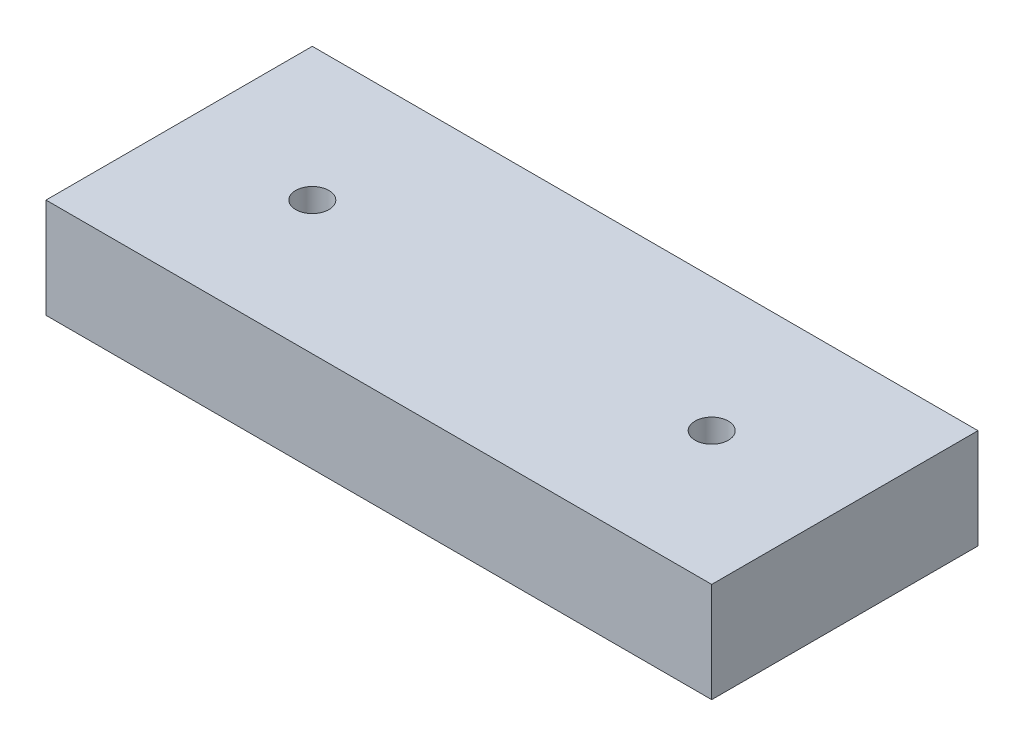
ISO-10303-21;
HEADER;
FILE_DESCRIPTION(('STEP AP214'),'2;1');
FILE_NAME('part.step','',(''),(''),'','','');
FILE_SCHEMA(('AUTOMOTIVE_DESIGN { 1 0 10303 214 1 1 1 1 }'));
ENDSEC;
DATA;
#1=APPLICATION_CONTEXT('core data for automotive mechanical design processes');
#2=APPLICATION_PROTOCOL_DEFINITION('international standard','automotive_design',2000,#1);
#3=PRODUCT_CONTEXT('',#1,'mechanical');
#4=PRODUCT('Part','Part','',(#3));
#5=PRODUCT_RELATED_PRODUCT_CATEGORY('part','',(#4));
#6=PRODUCT_DEFINITION_FORMATION('','',#4);
#7=PRODUCT_DEFINITION_CONTEXT('part definition',#1,'design');
#8=PRODUCT_DEFINITION('design','',#6,#7);
#9=PRODUCT_DEFINITION_SHAPE('','',#8);
#10=(LENGTH_UNIT() NAMED_UNIT(*) SI_UNIT(.MILLI.,.METRE.));
#11=(NAMED_UNIT(*) PLANE_ANGLE_UNIT() SI_UNIT($,.RADIAN.));
#12=(NAMED_UNIT(*) SI_UNIT($,.STERADIAN.) SOLID_ANGLE_UNIT());
#13=UNCERTAINTY_MEASURE_WITH_UNIT(LENGTH_MEASURE(1.E-05),#10,'distance_accuracy_value','');
#14=(GEOMETRIC_REPRESENTATION_CONTEXT(3) GLOBAL_UNCERTAINTY_ASSIGNED_CONTEXT((#13)) GLOBAL_UNIT_ASSIGNED_CONTEXT((#10,
#11,#12)) REPRESENTATION_CONTEXT('',''));
#15=CARTESIAN_POINT('',(0.,0.,0.));
#16=DIRECTION('',(0.,0.,1.));
#17=DIRECTION('',(1.,0.,0.));
#18=AXIS2_PLACEMENT_3D('',#15,#16,#17);
#19=CARTESIAN_POINT('',(0.,3.,-8.));
#20=DIRECTION('',(-1.,0.,0.));
#21=DIRECTION('',(0.,0.,1.));
#22=AXIS2_PLACEMENT_3D('',#19,#20,#21);
#23=PLANE('',#22);
#24=DIRECTION('',(0.,0.,-1.));
#25=VECTOR('',#24,1.);
#26=CARTESIAN_POINT('',(0.,0.,-8.));
#27=LINE('',#26,#25);
#28=CARTESIAN_POINT('',(0.,0.,0.));
#29=VERTEX_POINT('',#28);
#30=CARTESIAN_POINT('',(0.,0.,-8.));
#31=VERTEX_POINT('',#30);
#32=EDGE_CURVE('E95',#29,#31,#27,.T.);
#33=ORIENTED_EDGE('',*,*,#32,.T.);
#34=DIRECTION('',(0.,-1.,0.));
#35=VECTOR('',#34,1.);
#36=CARTESIAN_POINT('',(0.,3.,-8.));
#37=LINE('',#36,#35);
#38=CARTESIAN_POINT('',(0.,3.,-8.));
#39=VERTEX_POINT('',#38);
#40=EDGE_CURVE('E11',#39,#31,#37,.T.);
#41=ORIENTED_EDGE('',*,*,#40,.F.);
#42=DIRECTION('',(0.,0.,-1.));
#43=VECTOR('',#42,1.);
#44=CARTESIAN_POINT('',(0.,3.,-8.));
#45=LINE('',#44,#43);
#46=CARTESIAN_POINT('',(0.,3.,0.));
#47=VERTEX_POINT('',#46);
#48=EDGE_CURVE('E83',#47,#39,#45,.T.);
#49=ORIENTED_EDGE('',*,*,#48,.F.);
#50=DIRECTION('',(0.,-1.,0.));
#51=VECTOR('',#50,1.);
#52=CARTESIAN_POINT('',(0.,3.,0.));
#53=LINE('',#52,#51);
#54=EDGE_CURVE('E91',#47,#29,#53,.T.);
#55=ORIENTED_EDGE('',*,*,#54,.T.);
#56=EDGE_LOOP('',(#33,#41,#49,#55));
#57=FACE_BOUND('',#56,.T.);
#58=ADVANCED_FACE('F32',(#57),#23,.F.);
#59=CARTESIAN_POINT('',(0.,3.,-8.));
#60=DIRECTION('',(0.,0.,1.));
#61=DIRECTION('',(1.,0.,0.));
#62=AXIS2_PLACEMENT_3D('',#59,#60,#61);
#63=PLANE('',#62);
#64=DIRECTION('',(-1.,0.,0.));
#65=VECTOR('',#64,1.);
#66=CARTESIAN_POINT('',(0.,0.,-8.));
#67=LINE('',#66,#65);
#68=CARTESIAN_POINT('',(-20.,0.,-8.));
#69=VERTEX_POINT('',#68);
#70=EDGE_CURVE('E87',#31,#69,#67,.T.);
#71=ORIENTED_EDGE('',*,*,#70,.T.);
#72=DIRECTION('',(0.,-1.,0.));
#73=VECTOR('',#72,1.);
#74=CARTESIAN_POINT('',(-20.,3.,-8.));
#75=LINE('',#74,#73);
#76=CARTESIAN_POINT('',(-20.,3.,-8.));
#77=VERTEX_POINT('',#76);
#78=EDGE_CURVE('E40',#77,#69,#75,.T.);
#79=ORIENTED_EDGE('',*,*,#78,.F.);
#80=DIRECTION('',(-1.,0.,0.));
#81=VECTOR('',#80,1.);
#82=CARTESIAN_POINT('',(0.,3.,-8.));
#83=LINE('',#82,#81);
#84=EDGE_CURVE('E78',#39,#77,#83,.T.);
#85=ORIENTED_EDGE('',*,*,#84,.F.);
#86=ORIENTED_EDGE('',*,*,#40,.T.);
#87=EDGE_LOOP('',(#71,#79,#85,#86));
#88=FACE_BOUND('',#87,.T.);
#89=ADVANCED_FACE('F86',(#88),#63,.F.);
#90=CARTESIAN_POINT('',(-20.,3.,-8.));
#91=DIRECTION('',(1.,0.,0.));
#92=DIRECTION('',(0.,0.,-1.));
#93=AXIS2_PLACEMENT_3D('',#90,#91,#92);
#94=PLANE('',#93);
#95=DIRECTION('',(0.,0.,1.));
#96=VECTOR('',#95,1.);
#97=CARTESIAN_POINT('',(-20.,0.,-8.));
#98=LINE('',#97,#96);
#99=CARTESIAN_POINT('',(-20.,0.,0.));
#100=VERTEX_POINT('',#99);
#101=EDGE_CURVE('E65',#69,#100,#98,.T.);
#102=ORIENTED_EDGE('',*,*,#101,.T.);
#103=DIRECTION('',(0.,-1.,0.));
#104=VECTOR('',#103,1.);
#105=CARTESIAN_POINT('',(-20.,3.,0.));
#106=LINE('',#105,#104);
#107=CARTESIAN_POINT('',(-20.,3.,0.));
#108=VERTEX_POINT('',#107);
#109=EDGE_CURVE('E88',#108,#100,#106,.T.);
#110=ORIENTED_EDGE('',*,*,#109,.F.);
#111=DIRECTION('',(0.,0.,1.));
#112=VECTOR('',#111,1.);
#113=CARTESIAN_POINT('',(-20.,3.,-8.));
#114=LINE('',#113,#112);
#115=EDGE_CURVE('E81',#77,#108,#114,.T.);
#116=ORIENTED_EDGE('',*,*,#115,.F.);
#117=ORIENTED_EDGE('',*,*,#78,.T.);
#118=EDGE_LOOP('',(#102,#110,#116,#117));
#119=FACE_BOUND('',#118,.T.);
#120=ADVANCED_FACE('F89',(#119),#94,.F.);
#121=CARTESIAN_POINT('',(0.,3.,0.));
#122=DIRECTION('',(0.,0.,-1.));
#123=DIRECTION('',(-1.,0.,0.));
#124=AXIS2_PLACEMENT_3D('',#121,#122,#123);
#125=PLANE('',#124);
#126=DIRECTION('',(1.,0.,0.));
#127=VECTOR('',#126,1.);
#128=CARTESIAN_POINT('',(0.,0.,0.));
#129=LINE('',#128,#127);
#130=EDGE_CURVE('E71',#100,#29,#129,.T.);
#131=ORIENTED_EDGE('',*,*,#130,.T.);
#132=ORIENTED_EDGE('',*,*,#54,.F.);
#133=DIRECTION('',(1.,0.,0.));
#134=VECTOR('',#133,1.);
#135=CARTESIAN_POINT('',(0.,3.,0.));
#136=LINE('',#135,#134);
#137=EDGE_CURVE('E48',#108,#47,#136,.T.);
#138=ORIENTED_EDGE('',*,*,#137,.F.);
#139=ORIENTED_EDGE('',*,*,#109,.T.);
#140=EDGE_LOOP('',(#131,#132,#138,#139));
#141=FACE_BOUND('',#140,.T.);
#142=ADVANCED_FACE('F103',(#141),#125,.F.);
#143=CARTESIAN_POINT('',(0.,3.,0.));
#144=DIRECTION('',(0.,-1.,0.));
#145=DIRECTION('',(0.,0.,-1.));
#146=AXIS2_PLACEMENT_3D('',#143,#144,#145);
#147=PLANE('',#146);
#148=CARTESIAN_POINT('',(-4.,3.,-4.));
#149=DIRECTION('',(0.,1.,0.));
#150=DIRECTION('',(0.,0.,1.));
#151=AXIS2_PLACEMENT_3D('',#148,#149,#150);
#152=CIRCLE('',#151,0.499999999999999);
#153=CARTESIAN_POINT('',(-4.,3.,-3.5));
#154=VERTEX_POINT('',#153);
#155=EDGE_CURVE('E115',#154,#154,#152,.T.);
#156=ORIENTED_EDGE('',*,*,#155,.F.);
#157=EDGE_LOOP('',(#156));
#158=FACE_BOUND('',#157,.T.);
#159=CARTESIAN_POINT('',(-16.,3.,-4.));
#160=DIRECTION('',(0.,1.,0.));
#161=DIRECTION('',(0.,0.,1.));
#162=AXIS2_PLACEMENT_3D('',#159,#160,#161);
#163=CIRCLE('',#162,0.499999999999999);
#164=CARTESIAN_POINT('',(-16.,3.,-3.5));
#165=VERTEX_POINT('',#164);
#166=EDGE_CURVE('E109',#165,#165,#163,.T.);
#167=ORIENTED_EDGE('',*,*,#166,.F.);
#168=EDGE_LOOP('',(#167));
#169=FACE_BOUND('',#168,.T.);
#170=ORIENTED_EDGE('',*,*,#48,.T.);
#171=ORIENTED_EDGE('',*,*,#84,.T.);
#172=ORIENTED_EDGE('',*,*,#115,.T.);
#173=ORIENTED_EDGE('',*,*,#137,.T.);
#174=EDGE_LOOP('',(#170,#171,#172,#173));
#175=FACE_BOUND('',#174,.T.);
#176=ADVANCED_FACE('F79',(#158,#169,#175),#147,.F.);
#177=CARTESIAN_POINT('',(0.,0.,0.));
#178=DIRECTION('',(0.,-1.,0.));
#179=DIRECTION('',(0.,0.,-1.));
#180=AXIS2_PLACEMENT_3D('',#177,#178,#179);
#181=PLANE('',#180);
#182=CARTESIAN_POINT('',(-4.,0.,-4.));
#183=DIRECTION('',(0.,1.,0.));
#184=DIRECTION('',(0.,0.,1.));
#185=AXIS2_PLACEMENT_3D('',#182,#183,#184);
#186=CIRCLE('',#185,0.499999999999999);
#187=CARTESIAN_POINT('',(-4.,0.,-3.5));
#188=VERTEX_POINT('',#187);
#189=EDGE_CURVE('E112',#188,#188,#186,.T.);
#190=ORIENTED_EDGE('',*,*,#189,.T.);
#191=EDGE_LOOP('',(#190));
#192=FACE_BOUND('',#191,.T.);
#193=CARTESIAN_POINT('',(-16.,0.,-4.));
#194=DIRECTION('',(0.,1.,0.));
#195=DIRECTION('',(0.,0.,1.));
#196=AXIS2_PLACEMENT_3D('',#193,#194,#195);
#197=CIRCLE('',#196,0.499999999999999);
#198=CARTESIAN_POINT('',(-16.,0.,-3.5));
#199=VERTEX_POINT('',#198);
#200=EDGE_CURVE('E98',#199,#199,#197,.T.);
#201=ORIENTED_EDGE('',*,*,#200,.T.);
#202=EDGE_LOOP('',(#201));
#203=FACE_BOUND('',#202,.T.);
#204=ORIENTED_EDGE('',*,*,#32,.F.);
#205=ORIENTED_EDGE('',*,*,#130,.F.);
#206=ORIENTED_EDGE('',*,*,#101,.F.);
#207=ORIENTED_EDGE('',*,*,#70,.F.);
#208=EDGE_LOOP('',(#204,#205,#206,#207));
#209=FACE_BOUND('',#208,.T.);
#210=ADVANCED_FACE('F106',(#192,#203,#209),#181,.T.);
#211=CARTESIAN_POINT('',(-16.,0.,-4.));
#212=DIRECTION('',(0.,1.,0.));
#213=DIRECTION('',(0.,0.,1.));
#214=AXIS2_PLACEMENT_3D('',#211,#212,#213);
#215=CYLINDRICAL_SURFACE('',#214,0.499999999999999);
#216=ORIENTED_EDGE('',*,*,#200,.F.);
#217=EDGE_LOOP('',(#216));
#218=FACE_BOUND('',#217,.T.);
#219=ORIENTED_EDGE('',*,*,#166,.T.);
#220=EDGE_LOOP('',(#219));
#221=FACE_BOUND('',#220,.T.);
#222=ADVANCED_FACE('F126',(#218,#221),#215,.F.);
#223=CARTESIAN_POINT('',(-4.,0.,-4.));
#224=DIRECTION('',(0.,1.,0.));
#225=DIRECTION('',(0.,0.,1.));
#226=AXIS2_PLACEMENT_3D('',#223,#224,#225);
#227=CYLINDRICAL_SURFACE('',#226,0.499999999999999);
#228=ORIENTED_EDGE('',*,*,#189,.F.);
#229=EDGE_LOOP('',(#228));
#230=FACE_BOUND('',#229,.T.);
#231=ORIENTED_EDGE('',*,*,#155,.T.);
#232=EDGE_LOOP('',(#231));
#233=FACE_BOUND('',#232,.T.);
#234=ADVANCED_FACE('F123',(#230,#233),#227,.F.);
#235=CLOSED_SHELL('',(#58,#89,#120,#142,#176,#210,#222,#234));
#236=MANIFOLD_SOLID_BREP('B2',#235);
#237=ADVANCED_BREP_SHAPE_REPRESENTATION('',(#18,#236),#14);
#238=SHAPE_DEFINITION_REPRESENTATION(#9,#237);
ENDSEC;
END-ISO-10303-21;
